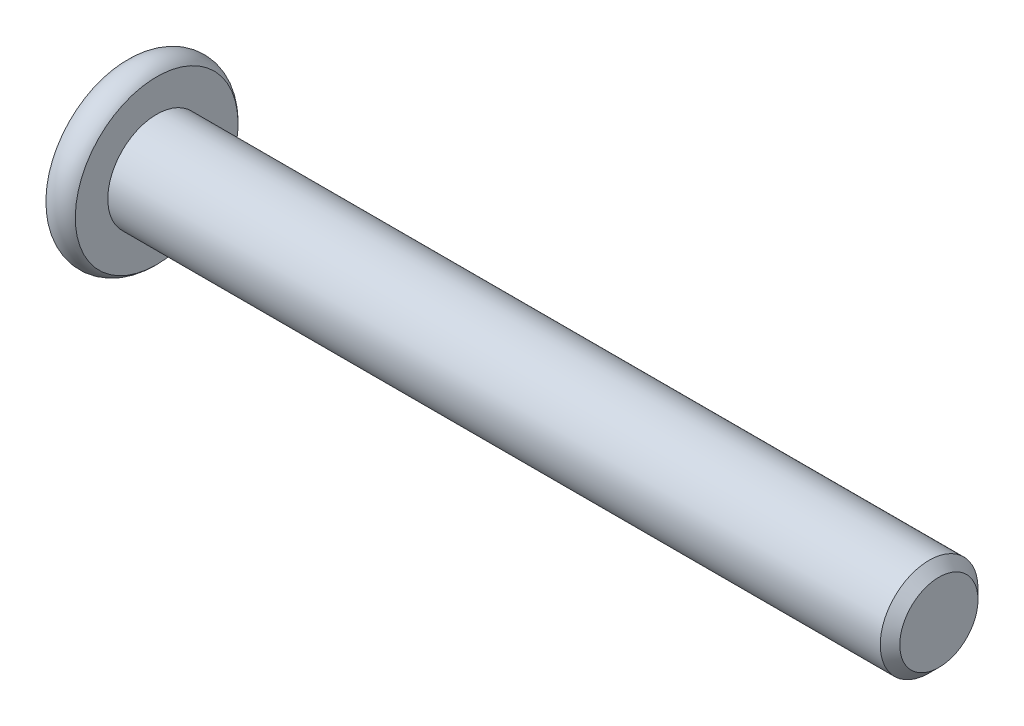
ISO-10303-21;
HEADER;
FILE_DESCRIPTION(('STEP AP214'),'2;1');
FILE_NAME('part.step','',(''),(''),'','','');
FILE_SCHEMA(('AUTOMOTIVE_DESIGN { 1 0 10303 214 1 1 1 1 }'));
ENDSEC;
DATA;
#1=APPLICATION_CONTEXT('core data for automotive mechanical design processes');
#2=APPLICATION_PROTOCOL_DEFINITION('international standard','automotive_design',2000,#1);
#3=PRODUCT_CONTEXT('',#1,'mechanical');
#4=PRODUCT('Part','Part','',(#3));
#5=PRODUCT_RELATED_PRODUCT_CATEGORY('part','',(#4));
#6=PRODUCT_DEFINITION_FORMATION('','',#4);
#7=PRODUCT_DEFINITION_CONTEXT('part definition',#1,'design');
#8=PRODUCT_DEFINITION('design','',#6,#7);
#9=PRODUCT_DEFINITION_SHAPE('','',#8);
#10=(LENGTH_UNIT() NAMED_UNIT(*) SI_UNIT(.MILLI.,.METRE.));
#11=(NAMED_UNIT(*) PLANE_ANGLE_UNIT() SI_UNIT($,.RADIAN.));
#12=(NAMED_UNIT(*) SI_UNIT($,.STERADIAN.) SOLID_ANGLE_UNIT());
#13=UNCERTAINTY_MEASURE_WITH_UNIT(LENGTH_MEASURE(1.E-05),#10,'distance_accuracy_value','');
#14=(GEOMETRIC_REPRESENTATION_CONTEXT(3) GLOBAL_UNCERTAINTY_ASSIGNED_CONTEXT((#13)) GLOBAL_UNIT_ASSIGNED_CONTEXT((#10,
#11,#12)) REPRESENTATION_CONTEXT('',''));
#15=CARTESIAN_POINT('',(0.,0.,0.));
#16=DIRECTION('',(0.,0.,1.));
#17=DIRECTION('',(1.,0.,0.));
#18=AXIS2_PLACEMENT_3D('',#15,#16,#17);
#19=CARTESIAN_POINT('',(-40.,0.,0.));
#20=DIRECTION('',(1.,0.,0.));
#21=DIRECTION('',(0.,0.,-1.));
#22=AXIS2_PLACEMENT_3D('',#19,#20,#21);
#23=CYLINDRICAL_SURFACE('',#22,2.5);
#24=CARTESIAN_POINT('',(-0.500000000000007,0.,0.));
#25=DIRECTION('',(1.,0.,0.));
#26=DIRECTION('',(0.,0.,-1.));
#27=AXIS2_PLACEMENT_3D('',#24,#25,#26);
#28=CIRCLE('',#27,2.5);
#29=CARTESIAN_POINT('',(-0.500000000000007,0.,-2.5));
#30=VERTEX_POINT('',#29);
#31=EDGE_CURVE('E51',#30,#30,#28,.F.);
#32=ORIENTED_EDGE('',*,*,#31,.T.);
#33=EDGE_LOOP('',(#32));
#34=FACE_BOUND('',#33,.T.);
#35=CARTESIAN_POINT('',(-40.,0.,0.));
#36=DIRECTION('',(-1.,0.,0.));
#37=DIRECTION('',(0.,-1.,0.));
#38=AXIS2_PLACEMENT_3D('',#35,#36,#37);
#39=CIRCLE('',#38,2.5);
#40=CARTESIAN_POINT('',(-40.,-2.50000000000001,0.));
#41=VERTEX_POINT('',#40);
#42=EDGE_CURVE('E127',#41,#41,#39,.F.);
#43=ORIENTED_EDGE('',*,*,#42,.T.);
#44=EDGE_LOOP('',(#43));
#45=FACE_BOUND('',#44,.T.);
#46=ADVANCED_FACE('F37',(#34,#45),#23,.T.);
#47=CARTESIAN_POINT('',(0.,0.,0.));
#48=DIRECTION('',(1.,0.,0.));
#49=DIRECTION('',(0.,0.,-1.));
#50=AXIS2_PLACEMENT_3D('',#47,#48,#49);
#51=PLANE('',#50);
#52=CARTESIAN_POINT('',(0.,0.,0.));
#53=DIRECTION('',(1.,0.,0.));
#54=DIRECTION('',(0.,0.,-1.));
#55=AXIS2_PLACEMENT_3D('',#52,#53,#54);
#56=CIRCLE('',#55,1.99999999999999);
#57=CARTESIAN_POINT('',(0.,0.,-1.99999999999999));
#58=VERTEX_POINT('',#57);
#59=EDGE_CURVE('E130',#58,#58,#56,.T.);
#60=ORIENTED_EDGE('',*,*,#59,.T.);
#61=EDGE_LOOP('',(#60));
#62=FACE_BOUND('',#61,.T.);
#63=ADVANCED_FACE('F140',(#62),#51,.T.);
#64=CARTESIAN_POINT('',(0.,0.,0.));
#65=DIRECTION('',(-1.,0.,0.));
#66=DIRECTION('',(0.,0.,1.));
#67=AXIS2_PLACEMENT_3D('',#64,#65,#66);
#68=CONICAL_SURFACE('',#67,1.99999999999999,0.785398163397447);
#69=ORIENTED_EDGE('',*,*,#31,.F.);
#70=EDGE_LOOP('',(#69));
#71=FACE_BOUND('',#70,.T.);
#72=ORIENTED_EDGE('',*,*,#59,.F.);
#73=EDGE_LOOP('',(#72));
#74=FACE_BOUND('',#73,.T.);
#75=ADVANCED_FACE('F39',(#71,#74),#68,.T.);
#76=CARTESIAN_POINT('',(-41.5,0.,0.));
#77=DIRECTION('',(1.,0.,0.));
#78=DIRECTION('',(0.,1.,0.));
#79=AXIS2_PLACEMENT_3D('',#76,#77,#78);
#80=PLANE('',#79);
#81=CARTESIAN_POINT('',(-41.5,1.58435790866593E-13,0.));
#82=DIRECTION('',(-1.,0.,0.));
#83=DIRECTION('',(0.,-1.,0.));
#84=AXIS2_PLACEMENT_3D('',#81,#82,#83);
#85=CIRCLE('',#84,1.78205080756883);
#86=CARTESIAN_POINT('',(-41.5,-1.78205080756867,0.));
#87=VERTEX_POINT('',#86);
#88=EDGE_CURVE('E245',#87,#87,#85,.T.);
#89=ORIENTED_EDGE('',*,*,#88,.F.);
#90=EDGE_LOOP('',(#89));
#91=FACE_BOUND('',#90,.T.);
#92=CARTESIAN_POINT('',(-41.5,0.,0.));
#93=DIRECTION('',(-1.,0.,0.));
#94=DIRECTION('',(0.,-1.,0.));
#95=AXIS2_PLACEMENT_3D('',#92,#93,#94);
#96=CIRCLE('',#95,4.16143782776615);
#97=CARTESIAN_POINT('',(-41.5,-4.16143782776615,0.));
#98=VERTEX_POINT('',#97);
#99=EDGE_CURVE('E124',#98,#98,#96,.T.);
#100=ORIENTED_EDGE('',*,*,#99,.T.);
#101=EDGE_LOOP('',(#100));
#102=FACE_BOUND('',#101,.T.);
#103=ADVANCED_FACE('F139',(#91,#102),#80,.F.);
#104=CARTESIAN_POINT('',(-40.75,0.,0.));
#105=DIRECTION('',(-1.,0.,0.));
#106=DIRECTION('',(0.,-1.,0.));
#107=AXIS2_PLACEMENT_3D('',#104,#105,#106);
#108=TOROIDAL_SURFACE('',#107,3.5,1.);
#109=ORIENTED_EDGE('',*,*,#99,.F.);
#110=EDGE_LOOP('',(#109));
#111=FACE_BOUND('',#110,.T.);
#112=CARTESIAN_POINT('',(-40.,0.,0.));
#113=DIRECTION('',(-1.,0.,0.));
#114=DIRECTION('',(0.,-1.,0.));
#115=AXIS2_PLACEMENT_3D('',#112,#113,#114);
#116=CIRCLE('',#115,4.16143782776615);
#117=CARTESIAN_POINT('',(-40.,-4.16143782776615,0.));
#118=VERTEX_POINT('',#117);
#119=EDGE_CURVE('E121',#118,#118,#116,.T.);
#120=ORIENTED_EDGE('',*,*,#119,.T.);
#121=EDGE_LOOP('',(#120));
#122=FACE_BOUND('',#121,.T.);
#123=ADVANCED_FACE('F151',(#111,#122),#108,.T.);
#124=CARTESIAN_POINT('',(-40.,4.16143782776615,0.));
#125=DIRECTION('',(-1.,0.,0.));
#126=DIRECTION('',(0.,-1.,0.));
#127=AXIS2_PLACEMENT_3D('',#124,#125,#126);
#128=PLANE('',#127);
#129=ORIENTED_EDGE('',*,*,#42,.F.);
#130=EDGE_LOOP('',(#129));
#131=FACE_BOUND('',#130,.T.);
#132=ORIENTED_EDGE('',*,*,#119,.F.);
#133=EDGE_LOOP('',(#132));
#134=FACE_BOUND('',#133,.T.);
#135=ADVANCED_FACE('F155',(#131,#134),#128,.F.);
#136=CARTESIAN_POINT('',(-41.5,1.58435790866593E-13,0.));
#137=DIRECTION('',(-1.,0.,0.));
#138=DIRECTION('',(0.,-1.,0.));
#139=AXIS2_PLACEMENT_3D('',#136,#137,#138);
#140=CONICAL_SURFACE('',#139,1.78205080756883,0.78539816339745);
#141=ORIENTED_EDGE('',*,*,#88,.T.);
#142=EDGE_LOOP('',(#141));
#143=FACE_BOUND('',#142,.T.);
#144=CARTESIAN_POINT('',(-42.015428085613,-1.74023253176564,1.5));
#145=CARTESIAN_POINT('',(-41.9833811073445,-1.69791724929717,1.5));
#146=CARTESIAN_POINT('',(-41.9516444672841,-1.65536760966778,1.5));
#147=CARTESIAN_POINT('',(-41.8889203936153,-1.56970398156671,1.5));
#148=CARTESIAN_POINT('',(-41.85793314822,-1.52658985542835,1.5));
#149=CARTESIAN_POINT('',(-41.765846164345,-1.3956262632655,1.5));
#150=CARTESIAN_POINT('',(-41.7061145123022,-1.30679868010562,1.5));
#151=CARTESIAN_POINT('',(-41.5887342891013,-1.12044622640202,1.5));
#152=CARTESIAN_POINT('',(-41.5314082774823,-1.02271587306659,1.5));
#153=CARTESIAN_POINT('',(-41.426463214976,-0.822357214965127,1.5));
#154=CARTESIAN_POINT('',(-41.3788114236896,-0.719746931701791,1.5));
#155=CARTESIAN_POINT('',(-41.3205099883151,-0.565852387094965,1.5));
#156=CARTESIAN_POINT('',(-41.3037990535409,-0.516874191424554,1.5));
#157=CARTESIAN_POINT('',(-41.2743077515089,-0.417723988457394,1.5));
#158=CARTESIAN_POINT('',(-41.261527651422,-0.367551900263761,1.5));
#159=CARTESIAN_POINT('',(-41.2407784202458,-0.267158299056013,1.5));
#160=CARTESIAN_POINT('',(-41.232726061826,-0.216954261864749,1.5));
#161=CARTESIAN_POINT('',(-41.2215916368341,-0.115994915871216,1.5));
#162=CARTESIAN_POINT('',(-41.2185086886377,-0.0652397064614344,1.5));
#163=CARTESIAN_POINT('',(-41.2175473897404,0.0344222234876606,1.5));
#164=CARTESIAN_POINT('',(-41.2194789216952,0.0833271701101944,1.5));
#165=CARTESIAN_POINT('',(-41.2280175729677,0.180724293127327,1.5));
#166=CARTESIAN_POINT('',(-41.2346251420481,0.229216429361834,1.5));
#167=CARTESIAN_POINT('',(-41.2522650626447,0.326258027697113,1.5));
#168=CARTESIAN_POINT('',(-41.263373168201,0.374793507450132,1.5));
#169=CARTESIAN_POINT('',(-41.2894198669596,0.470802295834285,1.5));
#170=CARTESIAN_POINT('',(-41.3043581560035,0.518275688481388,1.5));
#171=CARTESIAN_POINT('',(-41.356839545716,0.667150562065237,1.5));
#172=CARTESIAN_POINT('',(-41.4003351165442,0.766448362426956,1.5));
#173=CARTESIAN_POINT('',(-41.4970587814837,0.960384405673943,1.5));
#174=CARTESIAN_POINT('',(-41.5503217226675,1.05500437383632,1.5));
#175=CARTESIAN_POINT('',(-41.6602258010454,1.23584520321543,1.5));
#176=CARTESIAN_POINT('',(-41.7165682531046,1.32224986946561,1.5));
#177=CARTESIAN_POINT('',(-41.803675572597,1.44954953726484,1.5));
#178=CARTESIAN_POINT('',(-41.8330199906839,1.49143368482434,1.5));
#179=CARTESIAN_POINT('',(-41.8924869182931,1.57462914783255,1.5));
#180=CARTESIAN_POINT('',(-41.9226092115008,1.6159406177259,1.5));
#181=CARTESIAN_POINT('',(-41.9530541181366,1.65701358742564,1.5));
#182=B_SPLINE_CURVE_WITH_KNOTS('',3,(#144,#145,#146,#147,#148,#149,#150,#151,#152,#153,#154,
#155,#156,#157,#158,#159,#160,#161,#162,#163,#164,#165,#166,#167,#168,#169,#170,#171,#172,#173,
#174,#175,#176,#177,#178,#179,#180,#181),.UNSPECIFIED.,.F.,.F.,(4,2,2,2,2,2,2,2,2,2,2,2,2,2,2,2,
2,2,4),(0.,0.159238974218353,0.318517535014545,0.639504781932385,0.979137893799186,
1.31760168934356,1.47272233841622,1.62785352839774,1.78016486537344,1.93244917778277,
2.07904486260295,2.2256546495833,2.37484213303396,2.52401777304037,2.84828365283773,
3.17372975666747,3.48303030530534,3.63644667013906,3.7898208222291),.UNSPECIFIED.);
#183=CARTESIAN_POINT('',(-41.4500000000001,-0.866025403784281,1.5));
#184=VERTEX_POINT('',#183);
#185=CARTESIAN_POINT('',(-41.45,0.866025403784597,1.5));
#186=VERTEX_POINT('',#185);
#187=EDGE_CURVE('E105',#184,#186,#182,.T.);
#188=ORIENTED_EDGE('',*,*,#187,.F.);
#189=CARTESIAN_POINT('',(-41.4501154816001,-1.73216627762256,-0.000199999999999616));
#190=CARTESIAN_POINT('',(-41.4203654760674,-1.70239359975899,0.0513677907370754));
#191=CARTESIAN_POINT('',(-41.3923624839104,-1.67212305186339,0.1037979176652));
#192=CARTESIAN_POINT('',(-41.3410892304402,-1.61039789003603,0.210709034055596));
#193=CARTESIAN_POINT('',(-41.3178475050444,-1.57893740312598,0.26520019581466));
#194=CARTESIAN_POINT('',(-41.2780337289923,-1.51549879897972,0.375079081357247));
#195=CARTESIAN_POINT('',(-41.261361585671,-1.48353684526794,0.430438809095197));
#196=CARTESIAN_POINT('',(-41.2356744568182,-1.41890915196196,0.542377257477149));
#197=CARTESIAN_POINT('',(-41.2266402904789,-1.38624538781103,0.598952556553007));
#198=CARTESIAN_POINT('',(-41.2184890812269,-1.32995210095284,0.69645538951644));
#199=CARTESIAN_POINT('',(-41.2172822529893,-1.30639533311108,0.737256908280466));
#200=CARTESIAN_POINT('',(-41.2193140571623,-1.25932335290178,0.818787969615858));
#201=CARTESIAN_POINT('',(-41.2225536707484,-1.23580815085298,0.85951749431463));
#202=CARTESIAN_POINT('',(-41.233291985982,-1.18900414978411,0.940584402163415));
#203=CARTESIAN_POINT('',(-41.2407946530188,-1.16571558211704,0.980921384598286));
#204=CARTESIAN_POINT('',(-41.2596516119283,-1.11952932016319,1.06091833691403));
#205=CARTESIAN_POINT('',(-41.2710075570186,-1.09663179808771,1.10057800851621));
#206=CARTESIAN_POINT('',(-41.3047216475927,-1.03798159809683,1.20216313477448));
#207=CARTESIAN_POINT('',(-41.3296218490934,-1.0025926714745,1.26345855370969));
#208=CARTESIAN_POINT('',(-41.3716566532716,-0.950557780604217,1.35358562846331));
#209=CARTESIAN_POINT('',(-41.3864251535591,-0.933410759676991,1.38328513990771));
#210=CARTESIAN_POINT('',(-41.4173105659402,-0.89943210199625,1.44213790138375));
#211=CARTESIAN_POINT('',(-41.4334268341218,-0.882600319285553,1.47129140422064));
#212=CARTESIAN_POINT('',(-41.4501154816001,-0.865909933730443,1.5002));
#213=B_SPLINE_CURVE_WITH_KNOTS('',3,(#189,#190,#191,#192,#193,#194,#195,#196,#197,#198,#199,
#200,#201,#202,#203,#204,#205,#206,#207,#208,#209,#210,#211,#212),.UNSPECIFIED.,.F.,.F.,(4,2,2,
2,2,2,2,2,2,2,2,4),(0.,0.199829143693303,0.400822987382384,0.598623720538175,0.795926240188886,
0.937113067959878,1.07833105577192,1.21968061668221,1.36109089931054,1.58570969637565,
1.69770705470963,1.80965120737193),.UNSPECIFIED.);
#214=CARTESIAN_POINT('',(-41.4500000000001,-1.73205080756872,0.));
#215=VERTEX_POINT('',#214);
#216=EDGE_CURVE('E201',#215,#184,#213,.T.);
#217=ORIENTED_EDGE('',*,*,#216,.F.);
#218=CARTESIAN_POINT('',(-41.4501154816001,-0.865909933730442,-1.5002));
#219=CARTESIAN_POINT('',(-41.4203654760674,-0.895682611594007,-1.44863220926292));
#220=CARTESIAN_POINT('',(-41.3923624839104,-0.925953159489606,-1.3962020823348));
#221=CARTESIAN_POINT('',(-41.3410892304402,-0.987678321316965,-1.2892909659444));
#222=CARTESIAN_POINT('',(-41.3178475050444,-1.01913880822702,-1.23479980418534));
#223=CARTESIAN_POINT('',(-41.2780337289923,-1.08257741237329,-1.12492091864275));
#224=CARTESIAN_POINT('',(-41.2613615856709,-1.11453936608506,-1.0695611909048));
#225=CARTESIAN_POINT('',(-41.2356744568182,-1.17916705939105,-0.957622742522848));
#226=CARTESIAN_POINT('',(-41.2266402904789,-1.21183082354198,-0.90104744344699));
#227=CARTESIAN_POINT('',(-41.2184890812269,-1.26812411040016,-0.803544610483558));
#228=CARTESIAN_POINT('',(-41.2172822529893,-1.29168087824192,-0.762743091719533));
#229=CARTESIAN_POINT('',(-41.2193140571623,-1.33875285845122,-0.681212030384141));
#230=CARTESIAN_POINT('',(-41.2225536707484,-1.36226806050003,-0.640482505685369));
#231=CARTESIAN_POINT('',(-41.233291985982,-1.40907206156889,-0.559415597836583));
#232=CARTESIAN_POINT('',(-41.2407946530188,-1.43236062923596,-0.519078615401712));
#233=CARTESIAN_POINT('',(-41.2596516119283,-1.47854689118981,-0.439081663085969));
#234=CARTESIAN_POINT('',(-41.2710075570186,-1.5014444132653,-0.399421991483791));
#235=CARTESIAN_POINT('',(-41.3047216475927,-1.56009461325617,-0.297836865225514));
#236=CARTESIAN_POINT('',(-41.3296218490934,-1.5954835398785,-0.236541446290311));
#237=CARTESIAN_POINT('',(-41.3716566532716,-1.64751843074878,-0.146414371536687));
#238=CARTESIAN_POINT('',(-41.3864251535592,-1.66466545167601,-0.116714860092282));
#239=CARTESIAN_POINT('',(-41.4173105659402,-1.69864410935675,-0.0578620986162489));
#240=CARTESIAN_POINT('',(-41.4334268341218,-1.71547589206745,-0.0287085957793631));
#241=CARTESIAN_POINT('',(-41.4501154816001,-1.73216627762256,0.000199999999999295));
#242=B_SPLINE_CURVE_WITH_KNOTS('',3,(#218,#219,#220,#221,#222,#223,#224,#225,#226,#227,#228,
#229,#230,#231,#232,#233,#234,#235,#236,#237,#238,#239,#240,#241),.UNSPECIFIED.,.F.,.F.,(4,2,2,
2,2,2,2,2,2,2,2,4),(0.,0.199829143693304,0.400822987382389,0.598623720538183,0.795926240188891,
0.937113067959883,1.07833105577193,1.21968061668222,1.36109089931055,1.58570969637565,
1.69770705470964,1.80965120737194),.UNSPECIFIED.);
#243=CARTESIAN_POINT('',(-41.4500000000001,-0.86602540378428,-1.5));
#244=VERTEX_POINT('',#243);
#245=EDGE_CURVE('E195',#244,#215,#242,.T.);
#246=ORIENTED_EDGE('',*,*,#245,.F.);
#247=CARTESIAN_POINT('',(-42.015428085613,-1.74023253176563,-1.5));
#248=CARTESIAN_POINT('',(-41.9833811073445,-1.69791724929716,-1.5));
#249=CARTESIAN_POINT('',(-41.9516444672841,-1.65536760966778,-1.5));
#250=CARTESIAN_POINT('',(-41.8889203936153,-1.56970398156671,-1.5));
#251=CARTESIAN_POINT('',(-41.85793314822,-1.52658985542835,-1.5));
#252=CARTESIAN_POINT('',(-41.765846164345,-1.39562626326549,-1.5));
#253=CARTESIAN_POINT('',(-41.7061145123022,-1.30679868010562,-1.5));
#254=CARTESIAN_POINT('',(-41.5887342891013,-1.12044622640201,-1.5));
#255=CARTESIAN_POINT('',(-41.5314082774823,-1.02271587306659,-1.5));
#256=CARTESIAN_POINT('',(-41.426463214976,-0.822357214965123,-1.5));
#257=CARTESIAN_POINT('',(-41.3788114236896,-0.719746931701788,-1.5));
#258=CARTESIAN_POINT('',(-41.3205099883151,-0.565852387094964,-1.5));
#259=CARTESIAN_POINT('',(-41.3037990535409,-0.516874191424552,-1.5));
#260=CARTESIAN_POINT('',(-41.2743077515089,-0.417723988457392,-1.5));
#261=CARTESIAN_POINT('',(-41.261527651422,-0.367551900263759,-1.5));
#262=CARTESIAN_POINT('',(-41.2407784202458,-0.26715829905601,-1.5));
#263=CARTESIAN_POINT('',(-41.232726061826,-0.216954261864746,-1.5));
#264=CARTESIAN_POINT('',(-41.2215916368341,-0.115994915871213,-1.5));
#265=CARTESIAN_POINT('',(-41.2185086886377,-0.0652397064614307,-1.5));
#266=CARTESIAN_POINT('',(-41.2175473897404,0.0344222234876641,-1.5));
#267=CARTESIAN_POINT('',(-41.2194789216952,0.0833271701101973,-1.5));
#268=CARTESIAN_POINT('',(-41.2280175729677,0.180724293127329,-1.5));
#269=CARTESIAN_POINT('',(-41.2346251420481,0.229216429361837,-1.5));
#270=CARTESIAN_POINT('',(-41.2522650626447,0.326258027697115,-1.5));
#271=CARTESIAN_POINT('',(-41.263373168201,0.374793507450135,-1.5));
#272=CARTESIAN_POINT('',(-41.2894198669596,0.470802295834288,-1.5));
#273=CARTESIAN_POINT('',(-41.3043581560035,0.51827568848139,-1.5));
#274=CARTESIAN_POINT('',(-41.356839545716,0.66715056206524,-1.5));
#275=CARTESIAN_POINT('',(-41.4003351165442,0.76644836242696,-1.5));
#276=CARTESIAN_POINT('',(-41.4970587814837,0.960384405673948,-1.5));
#277=CARTESIAN_POINT('',(-41.5503217226675,1.05500437383632,-1.5));
#278=CARTESIAN_POINT('',(-41.6602258010454,1.23584520321543,-1.5));
#279=CARTESIAN_POINT('',(-41.7165682531046,1.32224986946561,-1.5));
#280=CARTESIAN_POINT('',(-41.8036755725971,1.44954953726485,-1.5));
#281=CARTESIAN_POINT('',(-41.8330199906839,1.49143368482435,-1.5));
#282=CARTESIAN_POINT('',(-41.8924869182931,1.57462914783256,-1.5));
#283=CARTESIAN_POINT('',(-41.9226092115008,1.61594061772591,-1.5));
#284=CARTESIAN_POINT('',(-41.9530541181366,1.65701358742564,-1.5));
#285=B_SPLINE_CURVE_WITH_KNOTS('',3,(#247,#248,#249,#250,#251,#252,#253,#254,#255,#256,#257,
#258,#259,#260,#261,#262,#263,#264,#265,#266,#267,#268,#269,#270,#271,#272,#273,#274,#275,#276,
#277,#278,#279,#280,#281,#282,#283,#284),.UNSPECIFIED.,.F.,.F.,(4,2,2,2,2,2,2,2,2,2,2,2,2,2,2,2,
2,2,4),(0.,0.159238974218354,0.318517535014539,0.639504781932379,0.979137893799186,
1.31760168934355,1.47272233841622,1.62785352839773,1.78016486537344,1.93244917778276,
2.07904486260295,2.22565464958329,2.37484213303396,2.52401777304036,2.84828365283772,
3.17372975666747,3.48303030530535,3.63644667013906,3.7898208222291),.UNSPECIFIED.);
#286=CARTESIAN_POINT('',(-41.45,0.866025403784597,-1.5));
#287=VERTEX_POINT('',#286);
#288=EDGE_CURVE('E58',#287,#244,#285,.F.);
#289=ORIENTED_EDGE('',*,*,#288,.F.);
#290=CARTESIAN_POINT('',(-41.4501154816001,1.73216627762287,0.000200000000001092));
#291=CARTESIAN_POINT('',(-41.4203654760674,1.70239359975931,-0.051367790737074));
#292=CARTESIAN_POINT('',(-41.3923624839104,1.67212305186371,-0.1037979176652));
#293=CARTESIAN_POINT('',(-41.3410892304402,1.61039789003635,-0.210709034055596));
#294=CARTESIAN_POINT('',(-41.3178475050444,1.5789374031263,-0.26520019581466));
#295=CARTESIAN_POINT('',(-41.2780337289923,1.51549879898003,-0.375079081357247));
#296=CARTESIAN_POINT('',(-41.2613615856709,1.48353684526826,-0.430438809095198));
#297=CARTESIAN_POINT('',(-41.2356744568181,1.41890915196227,-0.542377257477149));
#298=CARTESIAN_POINT('',(-41.2266402904789,1.38624538781134,-0.598952556553006));
#299=CARTESIAN_POINT('',(-41.2184890812269,1.32995210095315,-0.696455389516438));
#300=CARTESIAN_POINT('',(-41.2172822529893,1.3063953331114,-0.737256908280463));
#301=CARTESIAN_POINT('',(-41.2193140571623,1.25932335290209,-0.818787969615855));
#302=CARTESIAN_POINT('',(-41.2225536707483,1.23580815085329,-0.859517494314627));
#303=CARTESIAN_POINT('',(-41.233291985982,1.18900414978443,-0.940584402163413));
#304=CARTESIAN_POINT('',(-41.2407946530188,1.16571558211736,-0.980921384598285));
#305=CARTESIAN_POINT('',(-41.2596516119283,1.11952932016351,-1.06091833691403));
#306=CARTESIAN_POINT('',(-41.2710075570186,1.09663179808802,-1.1005780085162));
#307=CARTESIAN_POINT('',(-41.3047216475927,1.03798159809714,-1.20216313477448));
#308=CARTESIAN_POINT('',(-41.3296218490934,1.00259267147481,-1.26345855370969));
#309=CARTESIAN_POINT('',(-41.3716566532716,0.950557780604534,-1.35358562846331));
#310=CARTESIAN_POINT('',(-41.3864251535591,0.933410759677307,-1.38328513990772));
#311=CARTESIAN_POINT('',(-41.4173105659402,0.899432101996566,-1.44213790138375));
#312=CARTESIAN_POINT('',(-41.4334268341218,0.882600319285869,-1.47129140422064));
#313=CARTESIAN_POINT('',(-41.4501154816001,0.865909933730761,-1.5002));
#314=B_SPLINE_CURVE_WITH_KNOTS('',3,(#290,#291,#292,#293,#294,#295,#296,#297,#298,#299,#300,
#301,#302,#303,#304,#305,#306,#307,#308,#309,#310,#311,#312,#313),.UNSPECIFIED.,.F.,.F.,(4,2,2,
2,2,2,2,2,2,2,2,4),(0.,0.199829143693308,0.400822987382389,0.598623720538182,0.795926240188889,
0.93711306795988,1.07833105577193,1.21968061668222,1.36109089931054,1.58570969637565,
1.69770705470964,1.80965120737194),.UNSPECIFIED.);
#315=CARTESIAN_POINT('',(-41.45,1.73205080756904,0.));
#316=VERTEX_POINT('',#315);
#317=EDGE_CURVE('E11',#316,#287,#314,.T.);
#318=ORIENTED_EDGE('',*,*,#317,.F.);
#319=CARTESIAN_POINT('',(-41.4501154816001,0.865909933730759,1.5002));
#320=CARTESIAN_POINT('',(-41.4203654760674,0.895682611594323,1.44863220926292));
#321=CARTESIAN_POINT('',(-41.3923624839104,0.925953159489922,1.3962020823348));
#322=CARTESIAN_POINT('',(-41.3410892304402,0.98767832131728,1.28929096594441));
#323=CARTESIAN_POINT('',(-41.3178475050444,1.01913880822733,1.23479980418534));
#324=CARTESIAN_POINT('',(-41.2780337289923,1.0825774123736,1.12492091864275));
#325=CARTESIAN_POINT('',(-41.2613615856709,1.11453936608537,1.0695611909048));
#326=CARTESIAN_POINT('',(-41.2356744568181,1.17916705939136,0.957622742522851));
#327=CARTESIAN_POINT('',(-41.2266402904789,1.21183082354229,0.901047443446994));
#328=CARTESIAN_POINT('',(-41.2184890812269,1.26812411040048,0.803544610483562));
#329=CARTESIAN_POINT('',(-41.2172822529893,1.29168087824223,0.762743091719537));
#330=CARTESIAN_POINT('',(-41.2193140571623,1.33875285845154,0.681212030384145));
#331=CARTESIAN_POINT('',(-41.2225536707484,1.36226806050034,0.640482505685374));
#332=CARTESIAN_POINT('',(-41.233291985982,1.40907206156921,0.559415597836588));
#333=CARTESIAN_POINT('',(-41.2407946530188,1.43236062923628,0.519078615401716));
#334=CARTESIAN_POINT('',(-41.2596516119283,1.47854689119012,0.439081663085973));
#335=CARTESIAN_POINT('',(-41.2710075570186,1.50144441326561,0.399421991483796));
#336=CARTESIAN_POINT('',(-41.3047216475927,1.56009461325649,0.297836865225518));
#337=CARTESIAN_POINT('',(-41.3296218490934,1.59548353987882,0.236541446290314));
#338=CARTESIAN_POINT('',(-41.3716566532716,1.6475184307491,0.146414371536688));
#339=CARTESIAN_POINT('',(-41.3864251535591,1.66466545167633,0.116714860092282));
#340=CARTESIAN_POINT('',(-41.4173105659402,1.69864410935707,0.0578620986162477));
#341=CARTESIAN_POINT('',(-41.4334268341218,1.71547589206777,0.0287085957793611));
#342=CARTESIAN_POINT('',(-41.4501154816001,1.73216627762287,-0.000200000000001416));
#343=B_SPLINE_CURVE_WITH_KNOTS('',3,(#319,#320,#321,#322,#323,#324,#325,#326,#327,#328,#329,
#330,#331,#332,#333,#334,#335,#336,#337,#338,#339,#340,#341,#342),.UNSPECIFIED.,.F.,.F.,(4,2,2,
2,2,2,2,2,2,2,2,4),(0.,0.199829143693301,0.400822987382387,0.598623720538178,0.795926240188886,
0.937113067959877,1.07833105577192,1.21968061668221,1.36109089931054,1.58570969637565,
1.69770705470964,1.80965120737194),.UNSPECIFIED.);
#344=EDGE_CURVE('E96',#186,#316,#343,.T.);
#345=ORIENTED_EDGE('',*,*,#344,.F.);
#346=EDGE_LOOP('',(#188,#217,#246,#289,#318,#345));
#347=FACE_BOUND('',#346,.T.);
#348=ADVANCED_FACE('F95',(#143,#347),#140,.F.);
#349=CARTESIAN_POINT('',(-39.2,3.23731519082905E-13,0.));
#350=DIRECTION('',(-1.,0.,0.));
#351=DIRECTION('',(0.,-1.,0.));
#352=AXIS2_PLACEMENT_3D('',#349,#350,#351);
#353=PLANE('',#352);
#354=DIRECTION('',(0.,0.5,-0.866025403784439));
#355=VECTOR('',#354,1.);
#356=CARTESIAN_POINT('',(-39.2,0.866025403784588,1.5));
#357=LINE('',#356,#355);
#358=CARTESIAN_POINT('',(-39.2,0.866025403784588,1.5));
#359=VERTEX_POINT('',#358);
#360=CARTESIAN_POINT('',(-39.2,1.73205080756903,0.));
#361=VERTEX_POINT('',#360);
#362=EDGE_CURVE('E104',#359,#361,#357,.T.);
#363=ORIENTED_EDGE('',*,*,#362,.T.);
#364=DIRECTION('',(0.,-0.5,-0.866025403784439));
#365=VECTOR('',#364,1.);
#366=CARTESIAN_POINT('',(-39.2,1.73205080756903,0.));
#367=LINE('',#366,#365);
#368=CARTESIAN_POINT('',(-39.2,0.866025403784589,-1.5));
#369=VERTEX_POINT('',#368);
#370=EDGE_CURVE('E109',#361,#369,#367,.T.);
#371=ORIENTED_EDGE('',*,*,#370,.T.);
#372=DIRECTION('',(0.,-1.,0.));
#373=VECTOR('',#372,1.);
#374=CARTESIAN_POINT('',(-39.2,0.866025403784589,-1.5));
#375=LINE('',#374,#373);
#376=CARTESIAN_POINT('',(-39.2,-0.866025403784288,-1.5));
#377=VERTEX_POINT('',#376);
#378=EDGE_CURVE('E227',#369,#377,#375,.T.);
#379=ORIENTED_EDGE('',*,*,#378,.T.);
#380=DIRECTION('',(0.,-0.5,0.866025403784439));
#381=VECTOR('',#380,1.);
#382=CARTESIAN_POINT('',(-39.2,-0.866025403784288,-1.5));
#383=LINE('',#382,#381);
#384=CARTESIAN_POINT('',(-39.2,-1.73205080756873,0.));
#385=VERTEX_POINT('',#384);
#386=EDGE_CURVE('E231',#377,#385,#383,.T.);
#387=ORIENTED_EDGE('',*,*,#386,.T.);
#388=DIRECTION('',(0.,0.5,0.866025403784439));
#389=VECTOR('',#388,1.);
#390=CARTESIAN_POINT('',(-39.2,-1.73205080756873,0.));
#391=LINE('',#390,#389);
#392=CARTESIAN_POINT('',(-39.2,-0.866025403784289,1.5));
#393=VERTEX_POINT('',#392);
#394=EDGE_CURVE('E117',#385,#393,#391,.T.);
#395=ORIENTED_EDGE('',*,*,#394,.T.);
#396=DIRECTION('',(0.,1.,0.));
#397=VECTOR('',#396,1.);
#398=CARTESIAN_POINT('',(-39.2,-0.866025403784289,1.5));
#399=LINE('',#398,#397);
#400=EDGE_CURVE('E112',#393,#359,#399,.T.);
#401=ORIENTED_EDGE('',*,*,#400,.T.);
#402=EDGE_LOOP('',(#363,#371,#379,#387,#395,#401));
#403=FACE_BOUND('',#402,.T.);
#404=ADVANCED_FACE('F181',(#403),#353,.T.);
#405=CARTESIAN_POINT('',(-39.2,1.73205080756903,0.));
#406=DIRECTION('',(0.,0.866025403784439,-0.5));
#407=DIRECTION('',(0.,0.5,0.866025403784439));
#408=AXIS2_PLACEMENT_3D('',#405,#406,#407);
#409=PLANE('',#408);
#410=DIRECTION('',(-1.,0.,0.));
#411=VECTOR('',#410,1.);
#412=CARTESIAN_POINT('',(-39.2,1.73205080756903,0.));
#413=LINE('',#412,#411);
#414=EDGE_CURVE('E102',#361,#316,#413,.T.);
#415=ORIENTED_EDGE('',*,*,#414,.T.);
#416=ORIENTED_EDGE('',*,*,#317,.T.);
#417=DIRECTION('',(-1.,0.,0.));
#418=VECTOR('',#417,1.);
#419=CARTESIAN_POINT('',(-39.2,0.866025403784589,-1.5));
#420=LINE('',#419,#418);
#421=EDGE_CURVE('E111',#369,#287,#420,.T.);
#422=ORIENTED_EDGE('',*,*,#421,.F.);
#423=ORIENTED_EDGE('',*,*,#370,.F.);
#424=EDGE_LOOP('',(#415,#416,#422,#423));
#425=FACE_BOUND('',#424,.T.);
#426=ADVANCED_FACE('F107',(#425),#409,.F.);
#427=CARTESIAN_POINT('',(-39.2,0.866025403784589,-1.5));
#428=DIRECTION('',(0.,0.,-1.));
#429=DIRECTION('',(0.,1.,0.));
#430=AXIS2_PLACEMENT_3D('',#427,#428,#429);
#431=PLANE('',#430);
#432=ORIENTED_EDGE('',*,*,#421,.T.);
#433=ORIENTED_EDGE('',*,*,#288,.T.);
#434=DIRECTION('',(-1.,0.,0.));
#435=VECTOR('',#434,1.);
#436=CARTESIAN_POINT('',(-39.2,-0.866025403784288,-1.5));
#437=LINE('',#436,#435);
#438=EDGE_CURVE('E114',#377,#244,#437,.T.);
#439=ORIENTED_EDGE('',*,*,#438,.F.);
#440=ORIENTED_EDGE('',*,*,#378,.F.);
#441=EDGE_LOOP('',(#432,#433,#439,#440));
#442=FACE_BOUND('',#441,.T.);
#443=ADVANCED_FACE('F216',(#442),#431,.F.);
#444=CARTESIAN_POINT('',(-39.2,-0.866025403784288,-1.5));
#445=DIRECTION('',(0.,-0.866025403784438,-0.5));
#446=DIRECTION('',(0.,0.5,-0.866025403784439));
#447=AXIS2_PLACEMENT_3D('',#444,#445,#446);
#448=PLANE('',#447);
#449=ORIENTED_EDGE('',*,*,#438,.T.);
#450=ORIENTED_EDGE('',*,*,#245,.T.);
#451=DIRECTION('',(-1.,0.,0.));
#452=VECTOR('',#451,1.);
#453=CARTESIAN_POINT('',(-39.2,-1.73205080756873,0.));
#454=LINE('',#453,#452);
#455=EDGE_CURVE('E241',#385,#215,#454,.T.);
#456=ORIENTED_EDGE('',*,*,#455,.F.);
#457=ORIENTED_EDGE('',*,*,#386,.F.);
#458=EDGE_LOOP('',(#449,#450,#456,#457));
#459=FACE_BOUND('',#458,.T.);
#460=ADVANCED_FACE('F211',(#459),#448,.F.);
#461=CARTESIAN_POINT('',(-39.2,-1.73205080756873,0.));
#462=DIRECTION('',(0.,-0.866025403784439,0.5));
#463=DIRECTION('',(0.,-0.5,-0.866025403784439));
#464=AXIS2_PLACEMENT_3D('',#461,#462,#463);
#465=PLANE('',#464);
#466=ORIENTED_EDGE('',*,*,#455,.T.);
#467=ORIENTED_EDGE('',*,*,#216,.T.);
#468=DIRECTION('',(-1.,0.,0.));
#469=VECTOR('',#468,1.);
#470=CARTESIAN_POINT('',(-39.2,-0.866025403784289,1.5));
#471=LINE('',#470,#469);
#472=EDGE_CURVE('E238',#393,#184,#471,.T.);
#473=ORIENTED_EDGE('',*,*,#472,.F.);
#474=ORIENTED_EDGE('',*,*,#394,.F.);
#475=EDGE_LOOP('',(#466,#467,#473,#474));
#476=FACE_BOUND('',#475,.T.);
#477=ADVANCED_FACE('F208',(#476),#465,.F.);
#478=CARTESIAN_POINT('',(-39.2,-0.866025403784289,1.5));
#479=DIRECTION('',(0.,0.,1.));
#480=DIRECTION('',(1.,0.,0.));
#481=AXIS2_PLACEMENT_3D('',#478,#479,#480);
#482=PLANE('',#481);
#483=ORIENTED_EDGE('',*,*,#472,.T.);
#484=ORIENTED_EDGE('',*,*,#187,.T.);
#485=DIRECTION('',(-1.,0.,0.));
#486=VECTOR('',#485,1.);
#487=CARTESIAN_POINT('',(-39.2,0.866025403784588,1.5));
#488=LINE('',#487,#486);
#489=EDGE_CURVE('E65',#359,#186,#488,.T.);
#490=ORIENTED_EDGE('',*,*,#489,.F.);
#491=ORIENTED_EDGE('',*,*,#400,.F.);
#492=EDGE_LOOP('',(#483,#484,#490,#491));
#493=FACE_BOUND('',#492,.T.);
#494=ADVANCED_FACE('F162',(#493),#482,.F.);
#495=CARTESIAN_POINT('',(-39.2,0.866025403784588,1.5));
#496=DIRECTION('',(0.,0.866025403784438,0.5));
#497=DIRECTION('',(0.,-0.5,0.866025403784439));
#498=AXIS2_PLACEMENT_3D('',#495,#496,#497);
#499=PLANE('',#498);
#500=ORIENTED_EDGE('',*,*,#489,.T.);
#501=ORIENTED_EDGE('',*,*,#344,.T.);
#502=ORIENTED_EDGE('',*,*,#414,.F.);
#503=ORIENTED_EDGE('',*,*,#362,.F.);
#504=EDGE_LOOP('',(#500,#501,#502,#503));
#505=FACE_BOUND('',#504,.T.);
#506=ADVANCED_FACE('F101',(#505),#499,.F.);
#507=CLOSED_SHELL('',(#46,#63,#75,#103,#123,#135,#348,#404,#426,#443,#460,#477,#494,#506));
#508=MANIFOLD_SOLID_BREP('B2',#507);
#509=ADVANCED_BREP_SHAPE_REPRESENTATION('',(#18,#508),#14);
#510=SHAPE_DEFINITION_REPRESENTATION(#9,#509);
ENDSEC;
END-ISO-10303-21;
